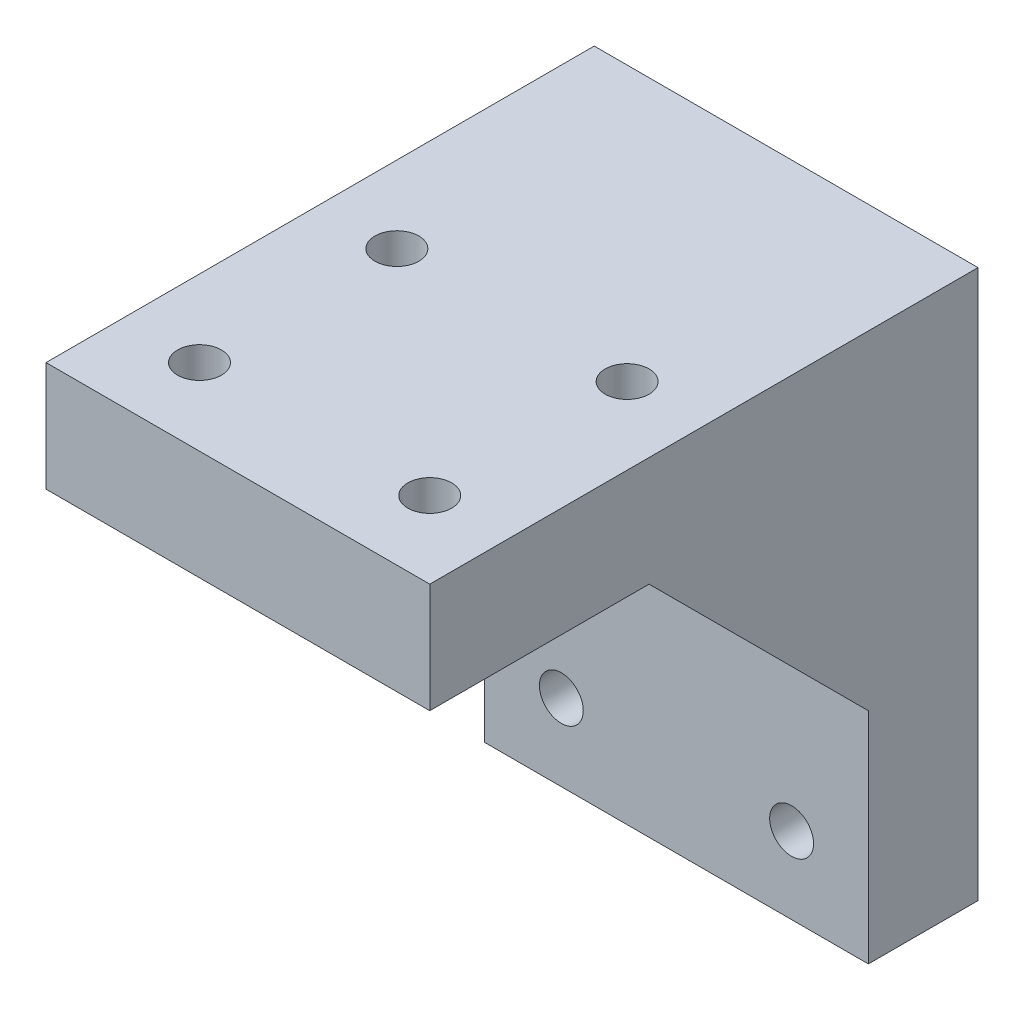
ISO-10303-21;
HEADER;
FILE_DESCRIPTION(('STEP AP214'),'2;1');
FILE_NAME('part.step','',(''),(''),'','','');
FILE_SCHEMA(('AUTOMOTIVE_DESIGN { 1 0 10303 214 1 1 1 1 }'));
ENDSEC;
DATA;
#1=APPLICATION_CONTEXT('core data for automotive mechanical design processes');
#2=APPLICATION_PROTOCOL_DEFINITION('international standard','automotive_design',2000,#1);
#3=PRODUCT_CONTEXT('',#1,'mechanical');
#4=PRODUCT('Part','Part','',(#3));
#5=PRODUCT_RELATED_PRODUCT_CATEGORY('part','',(#4));
#6=PRODUCT_DEFINITION_FORMATION('','',#4);
#7=PRODUCT_DEFINITION_CONTEXT('part definition',#1,'design');
#8=PRODUCT_DEFINITION('design','',#6,#7);
#9=PRODUCT_DEFINITION_SHAPE('','',#8);
#10=(LENGTH_UNIT() NAMED_UNIT(*) SI_UNIT(.MILLI.,.METRE.));
#11=(NAMED_UNIT(*) PLANE_ANGLE_UNIT() SI_UNIT($,.RADIAN.));
#12=(NAMED_UNIT(*) SI_UNIT($,.STERADIAN.) SOLID_ANGLE_UNIT());
#13=UNCERTAINTY_MEASURE_WITH_UNIT(LENGTH_MEASURE(1.E-05),#10,'distance_accuracy_value','');
#14=(GEOMETRIC_REPRESENTATION_CONTEXT(3) GLOBAL_UNCERTAINTY_ASSIGNED_CONTEXT((#13)) GLOBAL_UNIT_ASSIGNED_CONTEXT((#10,
#11,#12)) REPRESENTATION_CONTEXT('',''));
#15=CARTESIAN_POINT('',(0.,0.,0.));
#16=DIRECTION('',(0.,0.,1.));
#17=DIRECTION('',(1.,0.,0.));
#18=AXIS2_PLACEMENT_3D('',#15,#16,#17);
#19=CARTESIAN_POINT('',(-22.8048780487805,43.5670731707317,10.));
#20=DIRECTION('',(1.,0.,0.));
#21=DIRECTION('',(0.,1.,0.));
#22=AXIS2_PLACEMENT_3D('',#19,#20,#21);
#23=PLANE('',#22);
#24=DIRECTION('',(0.,-1.,0.));
#25=VECTOR('',#24,1.);
#26=CARTESIAN_POINT('',(-22.8048780487805,43.5670731707317,10.));
#27=LINE('',#26,#25);
#28=CARTESIAN_POINT('',(-22.8048780487805,13.5670731707317,10.));
#29=VERTEX_POINT('',#28);
#30=CARTESIAN_POINT('',(-22.8048780487805,-6.43292682926829,10.));
#31=VERTEX_POINT('',#30);
#32=EDGE_CURVE('E124',#29,#31,#27,.T.);
#33=ORIENTED_EDGE('',*,*,#32,.F.);
#34=DIRECTION('',(0.,0.707106781186548,0.707106781186547));
#35=VECTOR('',#34,1.);
#36=CARTESIAN_POINT('',(-22.8048780487805,33.5670731707317,30.));
#37=LINE('',#36,#35);
#38=CARTESIAN_POINT('',(-22.8048780487805,33.5670731707317,30.));
#39=VERTEX_POINT('',#38);
#40=EDGE_CURVE('E115',#29,#39,#37,.T.);
#41=ORIENTED_EDGE('',*,*,#40,.T.);
#42=DIRECTION('',(0.,0.,-1.));
#43=VECTOR('',#42,1.);
#44=CARTESIAN_POINT('',(-22.8048780487805,33.5670731707317,50.));
#45=LINE('',#44,#43);
#46=CARTESIAN_POINT('',(-22.8048780487805,33.5670731707317,50.));
#47=VERTEX_POINT('',#46);
#48=EDGE_CURVE('E94',#47,#39,#45,.T.);
#49=ORIENTED_EDGE('',*,*,#48,.F.);
#50=DIRECTION('',(0.,-1.,0.));
#51=VECTOR('',#50,1.);
#52=CARTESIAN_POINT('',(-22.8048780487805,43.5670731707317,50.));
#53=LINE('',#52,#51);
#54=CARTESIAN_POINT('',(-22.8048780487805,43.5670731707317,50.));
#55=VERTEX_POINT('',#54);
#56=EDGE_CURVE('E102',#55,#47,#53,.T.);
#57=ORIENTED_EDGE('',*,*,#56,.F.);
#58=DIRECTION('',(0.,0.,-1.));
#59=VECTOR('',#58,1.);
#60=CARTESIAN_POINT('',(-22.8048780487805,43.5670731707317,10.));
#61=LINE('',#60,#59);
#62=CARTESIAN_POINT('',(-22.8048780487805,43.5670731707317,0.));
#63=VERTEX_POINT('',#62);
#64=EDGE_CURVE('E129',#55,#63,#61,.T.);
#65=ORIENTED_EDGE('',*,*,#64,.T.);
#66=DIRECTION('',(0.,-1.,0.));
#67=VECTOR('',#66,1.);
#68=CARTESIAN_POINT('',(-22.8048780487805,43.5670731707317,0.));
#69=LINE('',#68,#67);
#70=CARTESIAN_POINT('',(-22.8048780487805,-6.43292682926829,0.));
#71=VERTEX_POINT('',#70);
#72=EDGE_CURVE('E116',#63,#71,#69,.T.);
#73=ORIENTED_EDGE('',*,*,#72,.T.);
#74=DIRECTION('',(0.,0.,-1.));
#75=VECTOR('',#74,1.);
#76=CARTESIAN_POINT('',(-22.8048780487805,-6.43292682926829,10.));
#77=LINE('',#76,#75);
#78=EDGE_CURVE('E11',#31,#71,#77,.T.);
#79=ORIENTED_EDGE('',*,*,#78,.F.);
#80=EDGE_LOOP('',(#33,#41,#49,#57,#65,#73,#79));
#81=FACE_BOUND('',#80,.T.);
#82=ADVANCED_FACE('F33',(#81),#23,.F.);
#83=CARTESIAN_POINT('',(-22.8048780487805,-6.43292682926829,10.));
#84=DIRECTION('',(0.,1.,0.));
#85=DIRECTION('',(0.,0.,1.));
#86=AXIS2_PLACEMENT_3D('',#83,#84,#85);
#87=PLANE('',#86);
#88=DIRECTION('',(1.,0.,0.));
#89=VECTOR('',#88,1.);
#90=CARTESIAN_POINT('',(-22.8048780487805,-6.43292682926829,0.));
#91=LINE('',#90,#89);
#92=CARTESIAN_POINT('',(12.1951219512195,-6.43292682926829,0.));
#93=VERTEX_POINT('',#92);
#94=EDGE_CURVE('E119',#71,#93,#91,.T.);
#95=ORIENTED_EDGE('',*,*,#94,.T.);
#96=DIRECTION('',(0.,0.,-1.));
#97=VECTOR('',#96,1.);
#98=CARTESIAN_POINT('',(12.1951219512195,-6.43292682926829,10.));
#99=LINE('',#98,#97);
#100=CARTESIAN_POINT('',(12.1951219512195,-6.43292682926829,10.));
#101=VERTEX_POINT('',#100);
#102=EDGE_CURVE('E41',#101,#93,#99,.T.);
#103=ORIENTED_EDGE('',*,*,#102,.F.);
#104=DIRECTION('',(1.,0.,0.));
#105=VECTOR('',#104,1.);
#106=CARTESIAN_POINT('',(-22.8048780487805,-6.43292682926829,10.));
#107=LINE('',#106,#105);
#108=EDGE_CURVE('E126',#31,#101,#107,.T.);
#109=ORIENTED_EDGE('',*,*,#108,.F.);
#110=ORIENTED_EDGE('',*,*,#78,.T.);
#111=EDGE_LOOP('',(#95,#103,#109,#110));
#112=FACE_BOUND('',#111,.T.);
#113=ADVANCED_FACE('F232',(#112),#87,.F.);
#114=CARTESIAN_POINT('',(12.1951219512195,43.5670731707317,10.));
#115=DIRECTION('',(-1.,0.,0.));
#116=DIRECTION('',(0.,-1.,0.));
#117=AXIS2_PLACEMENT_3D('',#114,#115,#116);
#118=PLANE('',#117);
#119=DIRECTION('',(0.,0.707106781186548,0.707106781186547));
#120=VECTOR('',#119,1.);
#121=CARTESIAN_POINT('',(12.1951219512195,33.5670731707317,30.));
#122=LINE('',#121,#120);
#123=CARTESIAN_POINT('',(12.1951219512195,13.5670731707317,10.));
#124=VERTEX_POINT('',#123);
#125=CARTESIAN_POINT('',(12.1951219512195,33.5670731707317,30.));
#126=VERTEX_POINT('',#125);
#127=EDGE_CURVE('E181',#124,#126,#122,.T.);
#128=ORIENTED_EDGE('',*,*,#127,.F.);
#129=DIRECTION('',(0.,1.,0.));
#130=VECTOR('',#129,1.);
#131=CARTESIAN_POINT('',(12.1951219512195,43.5670731707317,10.));
#132=LINE('',#131,#130);
#133=EDGE_CURVE('E49',#101,#124,#132,.T.);
#134=ORIENTED_EDGE('',*,*,#133,.F.);
#135=ORIENTED_EDGE('',*,*,#102,.T.);
#136=DIRECTION('',(0.,1.,0.));
#137=VECTOR('',#136,1.);
#138=CARTESIAN_POINT('',(12.1951219512195,43.5670731707317,0.));
#139=LINE('',#138,#137);
#140=CARTESIAN_POINT('',(12.1951219512195,43.5670731707317,0.));
#141=VERTEX_POINT('',#140);
#142=EDGE_CURVE('E132',#93,#141,#139,.T.);
#143=ORIENTED_EDGE('',*,*,#142,.T.);
#144=DIRECTION('',(0.,0.,-1.));
#145=VECTOR('',#144,1.);
#146=CARTESIAN_POINT('',(12.1951219512195,43.5670731707317,10.));
#147=LINE('',#146,#145);
#148=CARTESIAN_POINT('',(12.1951219512195,43.5670731707317,50.));
#149=VERTEX_POINT('',#148);
#150=EDGE_CURVE('E136',#149,#141,#147,.T.);
#151=ORIENTED_EDGE('',*,*,#150,.F.);
#152=DIRECTION('',(0.,1.,0.));
#153=VECTOR('',#152,1.);
#154=CARTESIAN_POINT('',(12.1951219512195,43.5670731707317,50.));
#155=LINE('',#154,#153);
#156=CARTESIAN_POINT('',(12.1951219512195,33.5670731707317,50.));
#157=VERTEX_POINT('',#156);
#158=EDGE_CURVE('E101',#157,#149,#155,.T.);
#159=ORIENTED_EDGE('',*,*,#158,.F.);
#160=DIRECTION('',(0.,0.,-1.));
#161=VECTOR('',#160,1.);
#162=CARTESIAN_POINT('',(12.1951219512195,33.5670731707317,50.));
#163=LINE('',#162,#161);
#164=EDGE_CURVE('E97',#157,#126,#163,.T.);
#165=ORIENTED_EDGE('',*,*,#164,.T.);
#166=EDGE_LOOP('',(#128,#134,#135,#143,#151,#159,#165));
#167=FACE_BOUND('',#166,.T.);
#168=ADVANCED_FACE('F236',(#167),#118,.F.);
#169=CARTESIAN_POINT('',(-22.8048780487805,43.5670731707317,10.));
#170=DIRECTION('',(0.,-1.,0.));
#171=DIRECTION('',(0.,0.,-1.));
#172=AXIS2_PLACEMENT_3D('',#169,#170,#171);
#173=PLANE('',#172);
#174=CARTESIAN_POINT('',(5.19512195121952,43.5670731707317,43.));
#175=DIRECTION('',(0.,-1.,0.));
#176=DIRECTION('',(0.,0.,-1.));
#177=AXIS2_PLACEMENT_3D('',#174,#175,#176);
#178=CIRCLE('',#177,2.);
#179=CARTESIAN_POINT('',(5.19512195121952,43.5670731707317,41.));
#180=VERTEX_POINT('',#179);
#181=EDGE_CURVE('E212',#180,#180,#178,.T.);
#182=ORIENTED_EDGE('',*,*,#181,.T.);
#183=EDGE_LOOP('',(#182));
#184=FACE_BOUND('',#183,.T.);
#185=CARTESIAN_POINT('',(-15.8048780487805,43.5670731707317,25.));
#186=DIRECTION('',(0.,-1.,0.));
#187=DIRECTION('',(0.,0.,-1.));
#188=AXIS2_PLACEMENT_3D('',#185,#186,#187);
#189=CIRCLE('',#188,2.);
#190=CARTESIAN_POINT('',(-15.8048780487805,43.5670731707317,23.));
#191=VERTEX_POINT('',#190);
#192=EDGE_CURVE('E209',#191,#191,#189,.T.);
#193=ORIENTED_EDGE('',*,*,#192,.T.);
#194=EDGE_LOOP('',(#193));
#195=FACE_BOUND('',#194,.T.);
#196=CARTESIAN_POINT('',(5.19512195121952,43.5670731707317,25.));
#197=DIRECTION('',(0.,-1.,0.));
#198=DIRECTION('',(0.,0.,-1.));
#199=AXIS2_PLACEMENT_3D('',#196,#197,#198);
#200=CIRCLE('',#199,2.);
#201=CARTESIAN_POINT('',(5.19512195121952,43.5670731707317,23.));
#202=VERTEX_POINT('',#201);
#203=EDGE_CURVE('E206',#202,#202,#200,.T.);
#204=ORIENTED_EDGE('',*,*,#203,.T.);
#205=EDGE_LOOP('',(#204));
#206=FACE_BOUND('',#205,.T.);
#207=CARTESIAN_POINT('',(-15.8048780487805,43.5670731707317,43.));
#208=DIRECTION('',(0.,-1.,0.));
#209=DIRECTION('',(0.,0.,-1.));
#210=AXIS2_PLACEMENT_3D('',#207,#208,#209);
#211=CIRCLE('',#210,2.);
#212=CARTESIAN_POINT('',(-15.8048780487805,43.5670731707317,41.));
#213=VERTEX_POINT('',#212);
#214=EDGE_CURVE('E203',#213,#213,#211,.T.);
#215=ORIENTED_EDGE('',*,*,#214,.T.);
#216=EDGE_LOOP('',(#215));
#217=FACE_BOUND('',#216,.T.);
#218=DIRECTION('',(-1.,0.,0.));
#219=VECTOR('',#218,1.);
#220=CARTESIAN_POINT('',(-22.8048780487805,43.5670731707317,0.));
#221=LINE('',#220,#219);
#222=EDGE_CURVE('E127',#141,#63,#221,.T.);
#223=ORIENTED_EDGE('',*,*,#222,.T.);
#224=ORIENTED_EDGE('',*,*,#64,.F.);
#225=DIRECTION('',(-1.,0.,0.));
#226=VECTOR('',#225,1.);
#227=CARTESIAN_POINT('',(-22.8048780487805,43.5670731707317,50.));
#228=LINE('',#227,#226);
#229=EDGE_CURVE('E108',#149,#55,#228,.T.);
#230=ORIENTED_EDGE('',*,*,#229,.F.);
#231=ORIENTED_EDGE('',*,*,#150,.T.);
#232=EDGE_LOOP('',(#223,#224,#230,#231));
#233=FACE_BOUND('',#232,.T.);
#234=ADVANCED_FACE('F222',(#184,#195,#206,#217,#233),#173,.F.);
#235=CARTESIAN_POINT('',(0.,0.,10.));
#236=DIRECTION('',(0.,0.,1.));
#237=DIRECTION('',(1.,0.,0.));
#238=AXIS2_PLACEMENT_3D('',#235,#236,#237);
#239=PLANE('',#238);
#240=DIRECTION('',(-1.,0.,0.));
#241=VECTOR('',#240,1.);
#242=CARTESIAN_POINT('',(12.1951219512195,13.5670731707317,10.));
#243=LINE('',#242,#241);
#244=EDGE_CURVE('E53',#124,#29,#243,.T.);
#245=ORIENTED_EDGE('',*,*,#244,.T.);
#246=ORIENTED_EDGE('',*,*,#32,.T.);
#247=ORIENTED_EDGE('',*,*,#108,.T.);
#248=ORIENTED_EDGE('',*,*,#133,.T.);
#249=EDGE_LOOP('',(#245,#246,#247,#248));
#250=FACE_BOUND('',#249,.T.);
#251=CARTESIAN_POINT('',(-15.8048780487805,0.56707317073171,10.));
#252=DIRECTION('',(0.,0.,1.));
#253=DIRECTION('',(1.,0.,0.));
#254=AXIS2_PLACEMENT_3D('',#251,#252,#253);
#255=CIRCLE('',#254,2.);
#256=CARTESIAN_POINT('',(-13.8048780487805,0.56707317073171,10.));
#257=VERTEX_POINT('',#256);
#258=EDGE_CURVE('E215',#257,#257,#255,.T.);
#259=ORIENTED_EDGE('',*,*,#258,.F.);
#260=EDGE_LOOP('',(#259));
#261=FACE_BOUND('',#260,.T.);
#262=CARTESIAN_POINT('',(5.19512195121952,0.56707317073171,10.));
#263=DIRECTION('',(0.,0.,1.));
#264=DIRECTION('',(1.,0.,0.));
#265=AXIS2_PLACEMENT_3D('',#262,#263,#264);
#266=CIRCLE('',#265,2.);
#267=CARTESIAN_POINT('',(7.19512195121952,0.56707317073171,10.));
#268=VERTEX_POINT('',#267);
#269=EDGE_CURVE('E145',#268,#268,#266,.T.);
#270=ORIENTED_EDGE('',*,*,#269,.F.);
#271=EDGE_LOOP('',(#270));
#272=FACE_BOUND('',#271,.T.);
#273=ADVANCED_FACE('F243',(#250,#261,#272),#239,.T.);
#274=CARTESIAN_POINT('',(0.,0.,0.));
#275=DIRECTION('',(0.,0.,1.));
#276=DIRECTION('',(1.,0.,0.));
#277=AXIS2_PLACEMENT_3D('',#274,#275,#276);
#278=PLANE('',#277);
#279=CARTESIAN_POINT('',(-15.8048780487805,0.56707317073171,0.));
#280=DIRECTION('',(0.,0.,1.));
#281=DIRECTION('',(1.,0.,0.));
#282=AXIS2_PLACEMENT_3D('',#279,#280,#281);
#283=CIRCLE('',#282,2.);
#284=CARTESIAN_POINT('',(-13.8048780487805,0.56707317073171,0.));
#285=VERTEX_POINT('',#284);
#286=EDGE_CURVE('E111',#285,#285,#283,.T.);
#287=ORIENTED_EDGE('',*,*,#286,.T.);
#288=EDGE_LOOP('',(#287));
#289=FACE_BOUND('',#288,.T.);
#290=CARTESIAN_POINT('',(5.19512195121951,18.5670731707317,0.));
#291=DIRECTION('',(0.,0.,1.));
#292=DIRECTION('',(1.,0.,0.));
#293=AXIS2_PLACEMENT_3D('',#290,#291,#292);
#294=CIRCLE('',#293,2.);
#295=CARTESIAN_POINT('',(7.19512195121952,18.5670731707317,0.));
#296=VERTEX_POINT('',#295);
#297=EDGE_CURVE('E148',#296,#296,#294,.T.);
#298=ORIENTED_EDGE('',*,*,#297,.T.);
#299=EDGE_LOOP('',(#298));
#300=FACE_BOUND('',#299,.T.);
#301=CARTESIAN_POINT('',(-15.8048780487805,18.5670731707317,0.));
#302=DIRECTION('',(0.,0.,1.));
#303=DIRECTION('',(1.,0.,0.));
#304=AXIS2_PLACEMENT_3D('',#301,#302,#303);
#305=CIRCLE('',#304,2.);
#306=CARTESIAN_POINT('',(-13.8048780487805,18.5670731707317,0.));
#307=VERTEX_POINT('',#306);
#308=EDGE_CURVE('E144',#307,#307,#305,.T.);
#309=ORIENTED_EDGE('',*,*,#308,.T.);
#310=EDGE_LOOP('',(#309));
#311=FACE_BOUND('',#310,.T.);
#312=CARTESIAN_POINT('',(5.19512195121952,0.56707317073171,0.));
#313=DIRECTION('',(0.,0.,1.));
#314=DIRECTION('',(1.,0.,0.));
#315=AXIS2_PLACEMENT_3D('',#312,#313,#314);
#316=CIRCLE('',#315,2.);
#317=CARTESIAN_POINT('',(7.19512195121952,0.56707317073171,0.));
#318=VERTEX_POINT('',#317);
#319=EDGE_CURVE('E141',#318,#318,#316,.T.);
#320=ORIENTED_EDGE('',*,*,#319,.T.);
#321=EDGE_LOOP('',(#320));
#322=FACE_BOUND('',#321,.T.);
#323=ORIENTED_EDGE('',*,*,#72,.F.);
#324=ORIENTED_EDGE('',*,*,#222,.F.);
#325=ORIENTED_EDGE('',*,*,#142,.F.);
#326=ORIENTED_EDGE('',*,*,#94,.F.);
#327=EDGE_LOOP('',(#323,#324,#325,#326));
#328=FACE_BOUND('',#327,.T.);
#329=ADVANCED_FACE('F227',(#289,#300,#311,#322,#328),#278,.F.);
#330=CARTESIAN_POINT('',(-22.8048780487805,33.5670731707317,50.));
#331=DIRECTION('',(0.,1.,0.));
#332=DIRECTION('',(0.,0.,1.));
#333=AXIS2_PLACEMENT_3D('',#330,#331,#332);
#334=PLANE('',#333);
#335=CARTESIAN_POINT('',(5.19512195121952,33.5670731707317,43.));
#336=DIRECTION('',(0.,-1.,0.));
#337=DIRECTION('',(0.,0.,-1.));
#338=AXIS2_PLACEMENT_3D('',#335,#336,#337);
#339=CIRCLE('',#338,2.);
#340=CARTESIAN_POINT('',(5.19512195121952,33.5670731707317,41.));
#341=VERTEX_POINT('',#340);
#342=EDGE_CURVE('E188',#341,#341,#339,.T.);
#343=ORIENTED_EDGE('',*,*,#342,.F.);
#344=EDGE_LOOP('',(#343));
#345=FACE_BOUND('',#344,.T.);
#346=CARTESIAN_POINT('',(-15.8048780487805,33.5670731707317,43.));
#347=DIRECTION('',(0.,-1.,0.));
#348=DIRECTION('',(0.,0.,-1.));
#349=AXIS2_PLACEMENT_3D('',#346,#347,#348);
#350=CIRCLE('',#349,2.);
#351=CARTESIAN_POINT('',(-15.8048780487805,33.5670731707317,41.));
#352=VERTEX_POINT('',#351);
#353=EDGE_CURVE('E200',#352,#352,#350,.T.);
#354=ORIENTED_EDGE('',*,*,#353,.F.);
#355=EDGE_LOOP('',(#354));
#356=FACE_BOUND('',#355,.T.);
#357=ORIENTED_EDGE('',*,*,#48,.T.);
#358=DIRECTION('',(-1.,0.,0.));
#359=VECTOR('',#358,1.);
#360=CARTESIAN_POINT('',(12.1951219512195,33.5670731707317,30.));
#361=LINE('',#360,#359);
#362=EDGE_CURVE('E186',#126,#39,#361,.T.);
#363=ORIENTED_EDGE('',*,*,#362,.F.);
#364=ORIENTED_EDGE('',*,*,#164,.F.);
#365=DIRECTION('',(1.,0.,0.));
#366=VECTOR('',#365,1.);
#367=CARTESIAN_POINT('',(-22.8048780487805,33.5670731707317,50.));
#368=LINE('',#367,#366);
#369=EDGE_CURVE('E90',#47,#157,#368,.T.);
#370=ORIENTED_EDGE('',*,*,#369,.F.);
#371=EDGE_LOOP('',(#357,#363,#364,#370));
#372=FACE_BOUND('',#371,.T.);
#373=ADVANCED_FACE('F92',(#345,#356,#372),#334,.F.);
#374=CARTESIAN_POINT('',(0.,0.,50.));
#375=DIRECTION('',(0.,0.,1.));
#376=DIRECTION('',(1.,0.,0.));
#377=AXIS2_PLACEMENT_3D('',#374,#375,#376);
#378=PLANE('',#377);
#379=ORIENTED_EDGE('',*,*,#56,.T.);
#380=ORIENTED_EDGE('',*,*,#369,.T.);
#381=ORIENTED_EDGE('',*,*,#158,.T.);
#382=ORIENTED_EDGE('',*,*,#229,.T.);
#383=EDGE_LOOP('',(#379,#380,#381,#382));
#384=FACE_BOUND('',#383,.T.);
#385=ADVANCED_FACE('F106',(#384),#378,.T.);
#386=CARTESIAN_POINT('',(5.19512195121952,0.56707317073171,-20.));
#387=DIRECTION('',(0.,0.,1.));
#388=DIRECTION('',(1.,0.,0.));
#389=AXIS2_PLACEMENT_3D('',#386,#387,#388);
#390=CYLINDRICAL_SURFACE('',#389,2.);
#391=ORIENTED_EDGE('',*,*,#269,.T.);
#392=EDGE_LOOP('',(#391));
#393=FACE_BOUND('',#392,.T.);
#394=ORIENTED_EDGE('',*,*,#319,.F.);
#395=EDGE_LOOP('',(#394));
#396=FACE_BOUND('',#395,.T.);
#397=ADVANCED_FACE('F265',(#393,#396),#390,.F.);
#398=CARTESIAN_POINT('',(-15.8048780487805,18.5670731707317,-20.));
#399=DIRECTION('',(0.,0.,1.));
#400=DIRECTION('',(1.,0.,0.));
#401=AXIS2_PLACEMENT_3D('',#398,#399,#400);
#402=CYLINDRICAL_SURFACE('',#401,2.);
#403=CARTESIAN_POINT('',(-15.8048780487805,18.5670731707317,10.));
#404=DIRECTION('',(0.,0.,-1.));
#405=DIRECTION('',(-1.,0.,0.));
#406=AXIS2_PLACEMENT_3D('',#403,#404,#405);
#407=CIRCLE('',#406,2.);
#408=CARTESIAN_POINT('',(-17.8048780487805,18.5670731707317,10.));
#409=VERTEX_POINT('',#408);
#410=EDGE_CURVE('E166',#409,#409,#407,.F.);
#411=ORIENTED_EDGE('',*,*,#410,.T.);
#412=EDGE_LOOP('',(#411));
#413=FACE_BOUND('',#412,.T.);
#414=ORIENTED_EDGE('',*,*,#308,.F.);
#415=EDGE_LOOP('',(#414));
#416=FACE_BOUND('',#415,.T.);
#417=ADVANCED_FACE('F288',(#413,#416),#402,.F.);
#418=CARTESIAN_POINT('',(5.19512195121951,18.5670731707317,-20.));
#419=DIRECTION('',(0.,0.,1.));
#420=DIRECTION('',(1.,0.,0.));
#421=AXIS2_PLACEMENT_3D('',#418,#419,#420);
#422=CYLINDRICAL_SURFACE('',#421,2.);
#423=CARTESIAN_POINT('',(5.19512195121951,18.5670731707317,10.));
#424=DIRECTION('',(0.,0.,-1.));
#425=DIRECTION('',(-1.,0.,0.));
#426=AXIS2_PLACEMENT_3D('',#423,#424,#425);
#427=CIRCLE('',#426,2.);
#428=CARTESIAN_POINT('',(3.19512195121951,18.5670731707317,10.));
#429=VERTEX_POINT('',#428);
#430=EDGE_CURVE('E180',#429,#429,#427,.F.);
#431=ORIENTED_EDGE('',*,*,#430,.T.);
#432=EDGE_LOOP('',(#431));
#433=FACE_BOUND('',#432,.T.);
#434=ORIENTED_EDGE('',*,*,#297,.F.);
#435=EDGE_LOOP('',(#434));
#436=FACE_BOUND('',#435,.T.);
#437=ADVANCED_FACE('F298',(#433,#436),#422,.F.);
#438=CARTESIAN_POINT('',(-15.8048780487805,0.56707317073171,-20.));
#439=DIRECTION('',(0.,0.,1.));
#440=DIRECTION('',(1.,0.,0.));
#441=AXIS2_PLACEMENT_3D('',#438,#439,#440);
#442=CYLINDRICAL_SURFACE('',#441,2.);
#443=ORIENTED_EDGE('',*,*,#258,.T.);
#444=EDGE_LOOP('',(#443));
#445=FACE_BOUND('',#444,.T.);
#446=ORIENTED_EDGE('',*,*,#286,.F.);
#447=EDGE_LOOP('',(#446));
#448=FACE_BOUND('',#447,.T.);
#449=ADVANCED_FACE('F308',(#445,#448),#442,.F.);
#450=CARTESIAN_POINT('',(-15.8048780487805,63.5670731707317,43.));
#451=DIRECTION('',(0.,-1.,0.));
#452=DIRECTION('',(0.,0.,-1.));
#453=AXIS2_PLACEMENT_3D('',#450,#451,#452);
#454=CYLINDRICAL_SURFACE('',#453,2.);
#455=ORIENTED_EDGE('',*,*,#353,.T.);
#456=EDGE_LOOP('',(#455));
#457=FACE_BOUND('',#456,.T.);
#458=ORIENTED_EDGE('',*,*,#214,.F.);
#459=EDGE_LOOP('',(#458));
#460=FACE_BOUND('',#459,.T.);
#461=ADVANCED_FACE('F318',(#457,#460),#454,.F.);
#462=CARTESIAN_POINT('',(5.19512195121952,63.5670731707317,25.));
#463=DIRECTION('',(0.,-1.,0.));
#464=DIRECTION('',(0.,0.,-1.));
#465=AXIS2_PLACEMENT_3D('',#462,#463,#464);
#466=CYLINDRICAL_SURFACE('',#465,2.);
#467=CARTESIAN_POINT('',(5.19512195121952,33.5670731707317,25.));
#468=DIRECTION('',(0.,1.,0.));
#469=DIRECTION('',(-1.,0.,0.));
#470=AXIS2_PLACEMENT_3D('',#467,#468,#469);
#471=CIRCLE('',#470,2.);
#472=CARTESIAN_POINT('',(3.19512195121952,33.5670731707317,25.));
#473=VERTEX_POINT('',#472);
#474=EDGE_CURVE('E159',#473,#473,#471,.F.);
#475=ORIENTED_EDGE('',*,*,#474,.T.);
#476=EDGE_LOOP('',(#475));
#477=FACE_BOUND('',#476,.T.);
#478=ORIENTED_EDGE('',*,*,#203,.F.);
#479=EDGE_LOOP('',(#478));
#480=FACE_BOUND('',#479,.T.);
#481=ADVANCED_FACE('F336',(#477,#480),#466,.F.);
#482=CARTESIAN_POINT('',(-15.8048780487805,63.5670731707317,25.));
#483=DIRECTION('',(0.,-1.,0.));
#484=DIRECTION('',(0.,0.,-1.));
#485=AXIS2_PLACEMENT_3D('',#482,#483,#484);
#486=CYLINDRICAL_SURFACE('',#485,2.);
#487=CARTESIAN_POINT('',(-15.8048780487805,33.5670731707317,25.));
#488=DIRECTION('',(0.,1.,0.));
#489=DIRECTION('',(-1.,0.,0.));
#490=AXIS2_PLACEMENT_3D('',#487,#488,#489);
#491=CIRCLE('',#490,2.);
#492=CARTESIAN_POINT('',(-17.8048780487805,33.5670731707317,25.));
#493=VERTEX_POINT('',#492);
#494=EDGE_CURVE('E185',#493,#493,#491,.F.);
#495=ORIENTED_EDGE('',*,*,#494,.T.);
#496=EDGE_LOOP('',(#495));
#497=FACE_BOUND('',#496,.T.);
#498=ORIENTED_EDGE('',*,*,#192,.F.);
#499=EDGE_LOOP('',(#498));
#500=FACE_BOUND('',#499,.T.);
#501=ADVANCED_FACE('F346',(#497,#500),#486,.F.);
#502=CARTESIAN_POINT('',(5.19512195121952,63.5670731707317,43.));
#503=DIRECTION('',(0.,-1.,0.));
#504=DIRECTION('',(0.,0.,-1.));
#505=AXIS2_PLACEMENT_3D('',#502,#503,#504);
#506=CYLINDRICAL_SURFACE('',#505,2.);
#507=ORIENTED_EDGE('',*,*,#342,.T.);
#508=EDGE_LOOP('',(#507));
#509=FACE_BOUND('',#508,.T.);
#510=ORIENTED_EDGE('',*,*,#181,.F.);
#511=EDGE_LOOP('',(#510));
#512=FACE_BOUND('',#511,.T.);
#513=ADVANCED_FACE('F355',(#509,#512),#506,.F.);
#514=CARTESIAN_POINT('',(12.1951219512195,33.5670731707317,30.));
#515=DIRECTION('',(0.,-0.707106781186547,0.707106781186548));
#516=DIRECTION('',(0.,-0.707106781186548,-0.707106781186547));
#517=AXIS2_PLACEMENT_3D('',#514,#515,#516);
#518=PLANE('',#517);
#519=CARTESIAN_POINT('',(5.19512195121951,18.5670731707317,15.));
#520=DIRECTION('',(0.,-0.707106781186547,0.707106781186548));
#521=DIRECTION('',(0.,-0.707106781186548,-0.707106781186547));
#522=AXIS2_PLACEMENT_3D('',#519,#520,#521);
#523=ELLIPSE('',#522,4.94974746830583,3.5);
#524=CARTESIAN_POINT('',(5.19512195121951,15.0670731707317,11.5));
#525=VERTEX_POINT('',#524);
#526=EDGE_CURVE('E36',#525,#525,#523,.T.);
#527=ORIENTED_EDGE('',*,*,#526,.F.);
#528=EDGE_LOOP('',(#527));
#529=FACE_BOUND('',#528,.T.);
#530=CARTESIAN_POINT('',(-15.8048780487805,18.5670731707317,15.));
#531=DIRECTION('',(0.,-0.707106781186547,0.707106781186548));
#532=DIRECTION('',(0.,-0.707106781186548,-0.707106781186547));
#533=AXIS2_PLACEMENT_3D('',#530,#531,#532);
#534=ELLIPSE('',#533,4.94974746830583,3.5);
#535=CARTESIAN_POINT('',(-15.8048780487805,15.0670731707317,11.5));
#536=VERTEX_POINT('',#535);
#537=EDGE_CURVE('E160',#536,#536,#534,.T.);
#538=ORIENTED_EDGE('',*,*,#537,.F.);
#539=EDGE_LOOP('',(#538));
#540=FACE_BOUND('',#539,.T.);
#541=CARTESIAN_POINT('',(5.19512195121952,28.5670731707317,25.));
#542=DIRECTION('',(0.,-0.707106781186547,0.707106781186548));
#543=DIRECTION('',(0.,0.707106781186548,0.707106781186547));
#544=AXIS2_PLACEMENT_3D('',#541,#542,#543);
#545=ELLIPSE('',#544,4.94974746830583,3.5);
#546=CARTESIAN_POINT('',(5.19512195121952,32.0670731707317,28.5));
#547=VERTEX_POINT('',#546);
#548=EDGE_CURVE('E156',#547,#547,#545,.T.);
#549=ORIENTED_EDGE('',*,*,#548,.F.);
#550=EDGE_LOOP('',(#549));
#551=FACE_BOUND('',#550,.T.);
#552=CARTESIAN_POINT('',(-15.8048780487805,28.5670731707317,25.));
#553=DIRECTION('',(0.,-0.707106781186547,0.707106781186548));
#554=DIRECTION('',(0.,0.707106781186548,0.707106781186547));
#555=AXIS2_PLACEMENT_3D('',#552,#553,#554);
#556=ELLIPSE('',#555,4.94974746830584,3.5);
#557=CARTESIAN_POINT('',(-15.8048780487805,32.0670731707317,28.5));
#558=VERTEX_POINT('',#557);
#559=EDGE_CURVE('E153',#558,#558,#556,.T.);
#560=ORIENTED_EDGE('',*,*,#559,.F.);
#561=EDGE_LOOP('',(#560));
#562=FACE_BOUND('',#561,.T.);
#563=ORIENTED_EDGE('',*,*,#40,.F.);
#564=ORIENTED_EDGE('',*,*,#244,.F.);
#565=ORIENTED_EDGE('',*,*,#127,.T.);
#566=ORIENTED_EDGE('',*,*,#362,.T.);
#567=EDGE_LOOP('',(#563,#564,#565,#566));
#568=FACE_BOUND('',#567,.T.);
#569=ADVANCED_FACE('F234',(#529,#540,#551,#562,#568),#518,.T.);
#570=CARTESIAN_POINT('',(-15.8048780487805,33.5670731707317,25.));
#571=DIRECTION('',(0.,1.,0.));
#572=DIRECTION('',(-1.,0.,0.));
#573=AXIS2_PLACEMENT_3D('',#570,#571,#572);
#574=PLANE('',#573);
#575=CARTESIAN_POINT('',(-15.8048780487805,33.5670731707317,25.));
#576=DIRECTION('',(0.,1.,0.));
#577=DIRECTION('',(-1.,0.,0.));
#578=AXIS2_PLACEMENT_3D('',#575,#576,#577);
#579=CIRCLE('',#578,3.5);
#580=CARTESIAN_POINT('',(-19.3048780487805,33.5670731707317,25.));
#581=VERTEX_POINT('',#580);
#582=EDGE_CURVE('E177',#581,#581,#579,.T.);
#583=ORIENTED_EDGE('',*,*,#582,.F.);
#584=EDGE_LOOP('',(#583));
#585=FACE_BOUND('',#584,.T.);
#586=ORIENTED_EDGE('',*,*,#494,.F.);
#587=EDGE_LOOP('',(#586));
#588=FACE_BOUND('',#587,.T.);
#589=ADVANCED_FACE('F373',(#585,#588),#574,.F.);
#590=CARTESIAN_POINT('',(-15.8048780487805,3.56707317073171,25.));
#591=DIRECTION('',(0.,1.,0.));
#592=DIRECTION('',(-1.,0.,0.));
#593=AXIS2_PLACEMENT_3D('',#590,#591,#592);
#594=CYLINDRICAL_SURFACE('',#593,3.5);
#595=ORIENTED_EDGE('',*,*,#559,.T.);
#596=EDGE_LOOP('',(#595));
#597=FACE_BOUND('',#596,.T.);
#598=ORIENTED_EDGE('',*,*,#582,.T.);
#599=EDGE_LOOP('',(#598));
#600=FACE_BOUND('',#599,.T.);
#601=ADVANCED_FACE('F383',(#597,#600),#594,.F.);
#602=CARTESIAN_POINT('',(5.19512195121952,33.5670731707317,25.));
#603=DIRECTION('',(0.,1.,0.));
#604=DIRECTION('',(-1.,0.,0.));
#605=AXIS2_PLACEMENT_3D('',#602,#603,#604);
#606=PLANE('',#605);
#607=CARTESIAN_POINT('',(5.19512195121952,33.5670731707317,25.));
#608=DIRECTION('',(0.,1.,0.));
#609=DIRECTION('',(-1.,0.,0.));
#610=AXIS2_PLACEMENT_3D('',#607,#608,#609);
#611=CIRCLE('',#610,3.5);
#612=CARTESIAN_POINT('',(1.69512195121952,33.5670731707317,25.));
#613=VERTEX_POINT('',#612);
#614=EDGE_CURVE('E157',#613,#613,#611,.T.);
#615=ORIENTED_EDGE('',*,*,#614,.F.);
#616=EDGE_LOOP('',(#615));
#617=FACE_BOUND('',#616,.T.);
#618=ORIENTED_EDGE('',*,*,#474,.F.);
#619=EDGE_LOOP('',(#618));
#620=FACE_BOUND('',#619,.T.);
#621=ADVANCED_FACE('F392',(#617,#620),#606,.F.);
#622=CARTESIAN_POINT('',(5.19512195121952,3.56707317073171,25.));
#623=DIRECTION('',(0.,1.,0.));
#624=DIRECTION('',(-1.,0.,0.));
#625=AXIS2_PLACEMENT_3D('',#622,#623,#624);
#626=CYLINDRICAL_SURFACE('',#625,3.5);
#627=ORIENTED_EDGE('',*,*,#548,.T.);
#628=EDGE_LOOP('',(#627));
#629=FACE_BOUND('',#628,.T.);
#630=ORIENTED_EDGE('',*,*,#614,.T.);
#631=EDGE_LOOP('',(#630));
#632=FACE_BOUND('',#631,.T.);
#633=ADVANCED_FACE('F400',(#629,#632),#626,.F.);
#634=CARTESIAN_POINT('',(-15.8048780487805,18.5670731707317,10.));
#635=DIRECTION('',(0.,0.,-1.));
#636=DIRECTION('',(-1.,0.,0.));
#637=AXIS2_PLACEMENT_3D('',#634,#635,#636);
#638=PLANE('',#637);
#639=CARTESIAN_POINT('',(-15.8048780487805,18.5670731707317,10.));
#640=DIRECTION('',(0.,0.,-1.));
#641=DIRECTION('',(-1.,0.,0.));
#642=AXIS2_PLACEMENT_3D('',#639,#640,#641);
#643=CIRCLE('',#642,3.5);
#644=CARTESIAN_POINT('',(-19.3048780487805,18.5670731707317,10.));
#645=VERTEX_POINT('',#644);
#646=EDGE_CURVE('E168',#645,#645,#643,.T.);
#647=ORIENTED_EDGE('',*,*,#646,.F.);
#648=EDGE_LOOP('',(#647));
#649=FACE_BOUND('',#648,.T.);
#650=ORIENTED_EDGE('',*,*,#410,.F.);
#651=EDGE_LOOP('',(#650));
#652=FACE_BOUND('',#651,.T.);
#653=ADVANCED_FACE('F407',(#649,#652),#638,.F.);
#654=CARTESIAN_POINT('',(-15.8048780487805,18.5670731707317,40.));
#655=DIRECTION('',(0.,0.,-1.));
#656=DIRECTION('',(-1.,0.,0.));
#657=AXIS2_PLACEMENT_3D('',#654,#655,#656);
#658=CYLINDRICAL_SURFACE('',#657,3.5);
#659=ORIENTED_EDGE('',*,*,#537,.T.);
#660=EDGE_LOOP('',(#659));
#661=FACE_BOUND('',#660,.T.);
#662=ORIENTED_EDGE('',*,*,#646,.T.);
#663=EDGE_LOOP('',(#662));
#664=FACE_BOUND('',#663,.T.);
#665=ADVANCED_FACE('F414',(#661,#664),#658,.F.);
#666=CARTESIAN_POINT('',(5.19512195121951,18.5670731707317,10.));
#667=DIRECTION('',(0.,0.,-1.));
#668=DIRECTION('',(-1.,0.,0.));
#669=AXIS2_PLACEMENT_3D('',#666,#667,#668);
#670=PLANE('',#669);
#671=CARTESIAN_POINT('',(5.19512195121951,18.5670731707317,10.));
#672=DIRECTION('',(0.,0.,-1.));
#673=DIRECTION('',(-1.,0.,0.));
#674=AXIS2_PLACEMENT_3D('',#671,#672,#673);
#675=CIRCLE('',#674,3.5);
#676=CARTESIAN_POINT('',(1.69512195121951,18.5670731707317,10.));
#677=VERTEX_POINT('',#676);
#678=EDGE_CURVE('E162',#677,#677,#675,.T.);
#679=ORIENTED_EDGE('',*,*,#678,.F.);
#680=EDGE_LOOP('',(#679));
#681=FACE_BOUND('',#680,.T.);
#682=ORIENTED_EDGE('',*,*,#430,.F.);
#683=EDGE_LOOP('',(#682));
#684=FACE_BOUND('',#683,.T.);
#685=ADVANCED_FACE('F422',(#681,#684),#670,.F.);
#686=CARTESIAN_POINT('',(5.19512195121951,18.5670731707317,40.));
#687=DIRECTION('',(0.,0.,-1.));
#688=DIRECTION('',(-1.,0.,0.));
#689=AXIS2_PLACEMENT_3D('',#686,#687,#688);
#690=CYLINDRICAL_SURFACE('',#689,3.5);
#691=ORIENTED_EDGE('',*,*,#526,.T.);
#692=EDGE_LOOP('',(#691));
#693=FACE_BOUND('',#692,.T.);
#694=ORIENTED_EDGE('',*,*,#678,.T.);
#695=EDGE_LOOP('',(#694));
#696=FACE_BOUND('',#695,.T.);
#697=ADVANCED_FACE('F429',(#693,#696),#690,.F.);
#698=CLOSED_SHELL('',(#82,#113,#168,#234,#273,#329,#373,#385,#397,#417,#437,#449,#461,#481,#501,
#513,#569,#589,#601,#621,#633,#653,#665,#685,#697));
#699=MANIFOLD_SOLID_BREP('B2',#698);
#700=ADVANCED_BREP_SHAPE_REPRESENTATION('',(#18,#699),#14);
#701=SHAPE_DEFINITION_REPRESENTATION(#9,#700);
ENDSEC;
END-ISO-10303-21;
